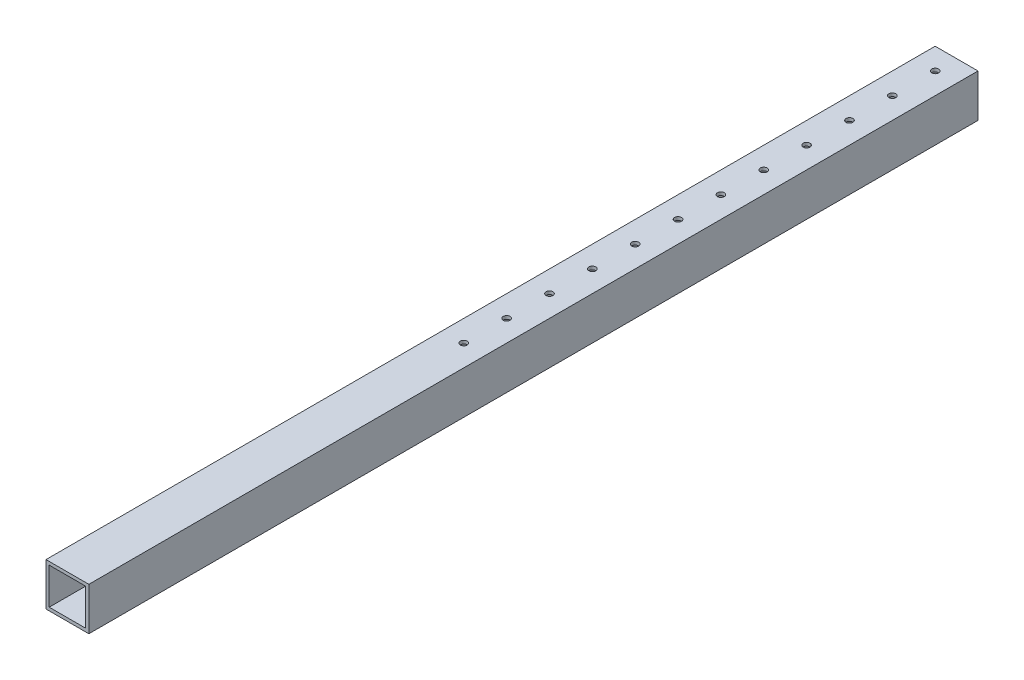
ISO-10303-21;
HEADER;
FILE_DESCRIPTION(('STEP AP214'),'2;1');
FILE_NAME('part.step','',(''),(''),'','','');
FILE_SCHEMA(('AUTOMOTIVE_DESIGN { 1 0 10303 214 1 1 1 1 }'));
ENDSEC;
DATA;
#1=APPLICATION_CONTEXT('core data for automotive mechanical design processes');
#2=APPLICATION_PROTOCOL_DEFINITION('international standard','automotive_design',2000,#1);
#3=PRODUCT_CONTEXT('',#1,'mechanical');
#4=PRODUCT('Part','Part','',(#3));
#5=PRODUCT_RELATED_PRODUCT_CATEGORY('part','',(#4));
#6=PRODUCT_DEFINITION_FORMATION('','',#4);
#7=PRODUCT_DEFINITION_CONTEXT('part definition',#1,'design');
#8=PRODUCT_DEFINITION('design','',#6,#7);
#9=PRODUCT_DEFINITION_SHAPE('','',#8);
#10=(LENGTH_UNIT() NAMED_UNIT(*) SI_UNIT(.MILLI.,.METRE.));
#11=(NAMED_UNIT(*) PLANE_ANGLE_UNIT() SI_UNIT($,.RADIAN.));
#12=(NAMED_UNIT(*) SI_UNIT($,.STERADIAN.) SOLID_ANGLE_UNIT());
#13=UNCERTAINTY_MEASURE_WITH_UNIT(LENGTH_MEASURE(1.E-05),#10,'distance_accuracy_value','');
#14=(GEOMETRIC_REPRESENTATION_CONTEXT(3) GLOBAL_UNCERTAINTY_ASSIGNED_CONTEXT((#13)) GLOBAL_UNIT_ASSIGNED_CONTEXT((#10,
#11,#12)) REPRESENTATION_CONTEXT('',''));
#15=CARTESIAN_POINT('',(0.,0.,0.));
#16=DIRECTION('',(0.,0.,1.));
#17=DIRECTION('',(1.,0.,0.));
#18=AXIS2_PLACEMENT_3D('',#15,#16,#17);
#19=CARTESIAN_POINT('',(0.,0.,415.));
#20=DIRECTION('',(0.,0.,1.));
#21=DIRECTION('',(1.,0.,0.));
#22=AXIS2_PLACEMENT_3D('',#19,#20,#21);
#23=PLANE('',#22);
#24=DIRECTION('',(0.,1.,0.));
#25=VECTOR('',#24,1.);
#26=CARTESIAN_POINT('',(10.,10.,415.));
#27=LINE('',#26,#25);
#28=CARTESIAN_POINT('',(10.,-10.,415.));
#29=VERTEX_POINT('',#28);
#30=CARTESIAN_POINT('',(10.,10.,415.));
#31=VERTEX_POINT('',#30);
#32=EDGE_CURVE('E146',#29,#31,#27,.T.);
#33=ORIENTED_EDGE('',*,*,#32,.T.);
#34=DIRECTION('',(-1.,0.,0.));
#35=VECTOR('',#34,1.);
#36=CARTESIAN_POINT('',(-10.,10.,415.));
#37=LINE('',#36,#35);
#38=CARTESIAN_POINT('',(-10.,10.,415.));
#39=VERTEX_POINT('',#38);
#40=EDGE_CURVE('E149',#31,#39,#37,.T.);
#41=ORIENTED_EDGE('',*,*,#40,.T.);
#42=DIRECTION('',(0.,-1.,0.));
#43=VECTOR('',#42,1.);
#44=CARTESIAN_POINT('',(-10.,10.,415.));
#45=LINE('',#44,#43);
#46=CARTESIAN_POINT('',(-10.,-10.,415.));
#47=VERTEX_POINT('',#46);
#48=EDGE_CURVE('E152',#39,#47,#45,.T.);
#49=ORIENTED_EDGE('',*,*,#48,.T.);
#50=DIRECTION('',(1.,0.,0.));
#51=VECTOR('',#50,1.);
#52=CARTESIAN_POINT('',(-10.,-10.,415.));
#53=LINE('',#52,#51);
#54=EDGE_CURVE('E154',#47,#29,#53,.T.);
#55=ORIENTED_EDGE('',*,*,#54,.T.);
#56=EDGE_LOOP('',(#33,#41,#49,#55));
#57=FACE_BOUND('',#56,.T.);
#58=DIRECTION('',(-1.,0.,0.));
#59=VECTOR('',#58,1.);
#60=CARTESIAN_POINT('',(-8.5,8.5,415.));
#61=LINE('',#60,#59);
#62=CARTESIAN_POINT('',(8.5,8.5,415.));
#63=VERTEX_POINT('',#62);
#64=CARTESIAN_POINT('',(-8.5,8.5,415.));
#65=VERTEX_POINT('',#64);
#66=EDGE_CURVE('E116',#63,#65,#61,.T.);
#67=ORIENTED_EDGE('',*,*,#66,.F.);
#68=DIRECTION('',(0.,1.,0.));
#69=VECTOR('',#68,1.);
#70=CARTESIAN_POINT('',(8.5,8.5,415.));
#71=LINE('',#70,#69);
#72=CARTESIAN_POINT('',(8.5,-8.5,415.));
#73=VERTEX_POINT('',#72);
#74=EDGE_CURVE('E108',#73,#63,#71,.T.);
#75=ORIENTED_EDGE('',*,*,#74,.F.);
#76=DIRECTION('',(1.,0.,0.));
#77=VECTOR('',#76,1.);
#78=CARTESIAN_POINT('',(-8.5,-8.5,415.));
#79=LINE('',#78,#77);
#80=CARTESIAN_POINT('',(-8.5,-8.5,415.));
#81=VERTEX_POINT('',#80);
#82=EDGE_CURVE('E130',#81,#73,#79,.T.);
#83=ORIENTED_EDGE('',*,*,#82,.F.);
#84=DIRECTION('',(0.,-1.,0.));
#85=VECTOR('',#84,1.);
#86=CARTESIAN_POINT('',(-8.5,8.5,415.));
#87=LINE('',#86,#85);
#88=EDGE_CURVE('E128',#65,#81,#87,.T.);
#89=ORIENTED_EDGE('',*,*,#88,.F.);
#90=EDGE_LOOP('',(#67,#75,#83,#89));
#91=FACE_BOUND('',#90,.T.);
#92=ADVANCED_FACE('F41',(#57,#91),#23,.T.);
#93=CARTESIAN_POINT('',(0.,0.,0.));
#94=DIRECTION('',(0.,0.,1.));
#95=DIRECTION('',(1.,0.,0.));
#96=AXIS2_PLACEMENT_3D('',#93,#94,#95);
#97=PLANE('',#96);
#98=DIRECTION('',(0.,1.,0.));
#99=VECTOR('',#98,1.);
#100=CARTESIAN_POINT('',(10.,10.,0.));
#101=LINE('',#100,#99);
#102=CARTESIAN_POINT('',(10.,-10.,0.));
#103=VERTEX_POINT('',#102);
#104=CARTESIAN_POINT('',(10.,10.,0.));
#105=VERTEX_POINT('',#104);
#106=EDGE_CURVE('E124',#103,#105,#101,.T.);
#107=ORIENTED_EDGE('',*,*,#106,.F.);
#108=DIRECTION('',(1.,0.,0.));
#109=VECTOR('',#108,1.);
#110=CARTESIAN_POINT('',(-10.,-10.,0.));
#111=LINE('',#110,#109);
#112=CARTESIAN_POINT('',(-10.,-10.,0.));
#113=VERTEX_POINT('',#112);
#114=EDGE_CURVE('E150',#113,#103,#111,.T.);
#115=ORIENTED_EDGE('',*,*,#114,.F.);
#116=DIRECTION('',(0.,-1.,0.));
#117=VECTOR('',#116,1.);
#118=CARTESIAN_POINT('',(-10.,10.,0.));
#119=LINE('',#118,#117);
#120=CARTESIAN_POINT('',(-10.,10.,0.));
#121=VERTEX_POINT('',#120);
#122=EDGE_CURVE('E161',#121,#113,#119,.T.);
#123=ORIENTED_EDGE('',*,*,#122,.F.);
#124=DIRECTION('',(-1.,0.,0.));
#125=VECTOR('',#124,1.);
#126=CARTESIAN_POINT('',(-10.,10.,0.));
#127=LINE('',#126,#125);
#128=EDGE_CURVE('E159',#105,#121,#127,.T.);
#129=ORIENTED_EDGE('',*,*,#128,.F.);
#130=EDGE_LOOP('',(#107,#115,#123,#129));
#131=FACE_BOUND('',#130,.T.);
#132=DIRECTION('',(0.,1.,0.));
#133=VECTOR('',#132,1.);
#134=CARTESIAN_POINT('',(8.5,8.5,0.));
#135=LINE('',#134,#133);
#136=CARTESIAN_POINT('',(8.5,-8.5,0.));
#137=VERTEX_POINT('',#136);
#138=CARTESIAN_POINT('',(8.5,8.5,0.));
#139=VERTEX_POINT('',#138);
#140=EDGE_CURVE('E66',#137,#139,#135,.T.);
#141=ORIENTED_EDGE('',*,*,#140,.T.);
#142=DIRECTION('',(-1.,0.,0.));
#143=VECTOR('',#142,1.);
#144=CARTESIAN_POINT('',(-8.5,8.5,0.));
#145=LINE('',#144,#143);
#146=CARTESIAN_POINT('',(-8.5,8.5,0.));
#147=VERTEX_POINT('',#146);
#148=EDGE_CURVE('E123',#139,#147,#145,.T.);
#149=ORIENTED_EDGE('',*,*,#148,.T.);
#150=DIRECTION('',(0.,-1.,0.));
#151=VECTOR('',#150,1.);
#152=CARTESIAN_POINT('',(-8.5,8.5,0.));
#153=LINE('',#152,#151);
#154=CARTESIAN_POINT('',(-8.5,-8.5,0.));
#155=VERTEX_POINT('',#154);
#156=EDGE_CURVE('E138',#147,#155,#153,.T.);
#157=ORIENTED_EDGE('',*,*,#156,.T.);
#158=DIRECTION('',(1.,0.,0.));
#159=VECTOR('',#158,1.);
#160=CARTESIAN_POINT('',(-8.5,-8.5,0.));
#161=LINE('',#160,#159);
#162=EDGE_CURVE('E117',#155,#137,#161,.T.);
#163=ORIENTED_EDGE('',*,*,#162,.T.);
#164=EDGE_LOOP('',(#141,#149,#157,#163));
#165=FACE_BOUND('',#164,.T.);
#166=ADVANCED_FACE('F261',(#131,#165),#97,.F.);
#167=CARTESIAN_POINT('',(10.,10.,415.));
#168=DIRECTION('',(-1.,0.,0.));
#169=DIRECTION('',(0.,-1.,0.));
#170=AXIS2_PLACEMENT_3D('',#167,#168,#169);
#171=PLANE('',#170);
#172=ORIENTED_EDGE('',*,*,#106,.T.);
#173=DIRECTION('',(0.,0.,-1.));
#174=VECTOR('',#173,1.);
#175=CARTESIAN_POINT('',(10.,10.,415.));
#176=LINE('',#175,#174);
#177=EDGE_CURVE('E11',#31,#105,#176,.T.);
#178=ORIENTED_EDGE('',*,*,#177,.F.);
#179=ORIENTED_EDGE('',*,*,#32,.F.);
#180=DIRECTION('',(0.,0.,-1.));
#181=VECTOR('',#180,1.);
#182=CARTESIAN_POINT('',(10.,-10.,415.));
#183=LINE('',#182,#181);
#184=EDGE_CURVE('E156',#29,#103,#183,.T.);
#185=ORIENTED_EDGE('',*,*,#184,.T.);
#186=EDGE_LOOP('',(#172,#178,#179,#185));
#187=FACE_BOUND('',#186,.T.);
#188=ADVANCED_FACE('F43',(#187),#171,.F.);
#189=CARTESIAN_POINT('',(-10.,10.,415.));
#190=DIRECTION('',(0.,-1.,0.));
#191=DIRECTION('',(0.,0.,-1.));
#192=AXIS2_PLACEMENT_3D('',#189,#190,#191);
#193=PLANE('',#192);
#194=CARTESIAN_POINT('',(0.,10.,10.));
#195=DIRECTION('',(0.,-1.,0.));
#196=DIRECTION('',(0.,0.,-1.));
#197=AXIS2_PLACEMENT_3D('',#194,#195,#196);
#198=CIRCLE('',#197,1.6);
#199=CARTESIAN_POINT('',(0.,10.,8.4));
#200=VERTEX_POINT('',#199);
#201=EDGE_CURVE('E175',#200,#200,#198,.T.);
#202=ORIENTED_EDGE('',*,*,#201,.T.);
#203=EDGE_LOOP('',(#202));
#204=FACE_BOUND('',#203,.T.);
#205=CARTESIAN_POINT('',(0.,10.,30.));
#206=DIRECTION('',(0.,-1.,0.));
#207=DIRECTION('',(0.,0.,-1.));
#208=AXIS2_PLACEMENT_3D('',#205,#206,#207);
#209=CIRCLE('',#208,1.6);
#210=CARTESIAN_POINT('',(0.,10.,28.4));
#211=VERTEX_POINT('',#210);
#212=EDGE_CURVE('E301',#211,#211,#209,.T.);
#213=ORIENTED_EDGE('',*,*,#212,.T.);
#214=EDGE_LOOP('',(#213));
#215=FACE_BOUND('',#214,.T.);
#216=CARTESIAN_POINT('',(-1.38434606754578E-13,10.,50.));
#217=DIRECTION('',(0.,-1.,0.));
#218=DIRECTION('',(0.,0.,-1.));
#219=AXIS2_PLACEMENT_3D('',#216,#217,#218);
#220=CIRCLE('',#219,1.6);
#221=CARTESIAN_POINT('',(-1.38434606754578E-13,10.,48.4));
#222=VERTEX_POINT('',#221);
#223=EDGE_CURVE('E305',#222,#222,#220,.T.);
#224=ORIENTED_EDGE('',*,*,#223,.T.);
#225=EDGE_LOOP('',(#224));
#226=FACE_BOUND('',#225,.T.);
#227=CARTESIAN_POINT('',(-2.07039586732293E-13,10.,70.));
#228=DIRECTION('',(0.,-1.,0.));
#229=DIRECTION('',(0.,0.,-1.));
#230=AXIS2_PLACEMENT_3D('',#227,#228,#229);
#231=CIRCLE('',#230,1.6);
#232=CARTESIAN_POINT('',(-2.07039586732293E-13,10.,68.4));
#233=VERTEX_POINT('',#232);
#234=EDGE_CURVE('E309',#233,#233,#231,.T.);
#235=ORIENTED_EDGE('',*,*,#234,.T.);
#236=EDGE_LOOP('',(#235));
#237=FACE_BOUND('',#236,.T.);
#238=CARTESIAN_POINT('',(-2.75644566710009E-13,10.,90.));
#239=DIRECTION('',(0.,-1.,0.));
#240=DIRECTION('',(0.,0.,-1.));
#241=AXIS2_PLACEMENT_3D('',#238,#239,#240);
#242=CIRCLE('',#241,1.6);
#243=CARTESIAN_POINT('',(-2.75644566710009E-13,10.,88.4));
#244=VERTEX_POINT('',#243);
#245=EDGE_CURVE('E313',#244,#244,#242,.T.);
#246=ORIENTED_EDGE('',*,*,#245,.T.);
#247=EDGE_LOOP('',(#246));
#248=FACE_BOUND('',#247,.T.);
#249=CARTESIAN_POINT('',(-3.44249546687724E-13,10.,110.));
#250=DIRECTION('',(0.,-1.,0.));
#251=DIRECTION('',(0.,0.,-1.));
#252=AXIS2_PLACEMENT_3D('',#249,#250,#251);
#253=CIRCLE('',#252,1.6);
#254=CARTESIAN_POINT('',(-3.44249546687724E-13,10.,108.4));
#255=VERTEX_POINT('',#254);
#256=EDGE_CURVE('E317',#255,#255,#253,.T.);
#257=ORIENTED_EDGE('',*,*,#256,.T.);
#258=EDGE_LOOP('',(#257));
#259=FACE_BOUND('',#258,.T.);
#260=CARTESIAN_POINT('',(-4.12854526665439E-13,10.,130.));
#261=DIRECTION('',(0.,-1.,0.));
#262=DIRECTION('',(0.,0.,-1.));
#263=AXIS2_PLACEMENT_3D('',#260,#261,#262);
#264=CIRCLE('',#263,1.6);
#265=CARTESIAN_POINT('',(-4.12854526665439E-13,10.,128.4));
#266=VERTEX_POINT('',#265);
#267=EDGE_CURVE('E321',#266,#266,#264,.T.);
#268=ORIENTED_EDGE('',*,*,#267,.T.);
#269=EDGE_LOOP('',(#268));
#270=FACE_BOUND('',#269,.T.);
#271=CARTESIAN_POINT('',(-4.81459506643155E-13,10.,150.));
#272=DIRECTION('',(0.,-1.,0.));
#273=DIRECTION('',(0.,0.,-1.));
#274=AXIS2_PLACEMENT_3D('',#271,#272,#273);
#275=CIRCLE('',#274,1.6);
#276=CARTESIAN_POINT('',(-4.81459506643155E-13,10.,148.4));
#277=VERTEX_POINT('',#276);
#278=EDGE_CURVE('E325',#277,#277,#275,.T.);
#279=ORIENTED_EDGE('',*,*,#278,.T.);
#280=EDGE_LOOP('',(#279));
#281=FACE_BOUND('',#280,.T.);
#282=CARTESIAN_POINT('',(-5.5006448662087E-13,10.,170.));
#283=DIRECTION('',(0.,-1.,0.));
#284=DIRECTION('',(0.,0.,-1.));
#285=AXIS2_PLACEMENT_3D('',#282,#283,#284);
#286=CIRCLE('',#285,1.6);
#287=CARTESIAN_POINT('',(-5.5006448662087E-13,10.,168.4));
#288=VERTEX_POINT('',#287);
#289=EDGE_CURVE('E329',#288,#288,#286,.T.);
#290=ORIENTED_EDGE('',*,*,#289,.T.);
#291=EDGE_LOOP('',(#290));
#292=FACE_BOUND('',#291,.T.);
#293=CARTESIAN_POINT('',(-6.18669466598585E-13,10.,190.));
#294=DIRECTION('',(0.,-1.,0.));
#295=DIRECTION('',(0.,0.,-1.));
#296=AXIS2_PLACEMENT_3D('',#293,#294,#295);
#297=CIRCLE('',#296,1.6);
#298=CARTESIAN_POINT('',(-6.18669466598585E-13,10.,188.4));
#299=VERTEX_POINT('',#298);
#300=EDGE_CURVE('E333',#299,#299,#297,.T.);
#301=ORIENTED_EDGE('',*,*,#300,.T.);
#302=EDGE_LOOP('',(#301));
#303=FACE_BOUND('',#302,.T.);
#304=CARTESIAN_POINT('',(-6.87274446576301E-13,10.,210.));
#305=DIRECTION('',(0.,-1.,0.));
#306=DIRECTION('',(0.,0.,-1.));
#307=AXIS2_PLACEMENT_3D('',#304,#305,#306);
#308=CIRCLE('',#307,1.6);
#309=CARTESIAN_POINT('',(-6.87274446576301E-13,10.,208.4));
#310=VERTEX_POINT('',#309);
#311=EDGE_CURVE('E337',#310,#310,#308,.T.);
#312=ORIENTED_EDGE('',*,*,#311,.T.);
#313=EDGE_LOOP('',(#312));
#314=FACE_BOUND('',#313,.T.);
#315=CARTESIAN_POINT('',(-7.55879426554016E-13,10.,230.));
#316=DIRECTION('',(0.,-1.,0.));
#317=DIRECTION('',(0.,0.,-1.));
#318=AXIS2_PLACEMENT_3D('',#315,#316,#317);
#319=CIRCLE('',#318,1.6);
#320=CARTESIAN_POINT('',(-7.55879426554016E-13,10.,228.4));
#321=VERTEX_POINT('',#320);
#322=EDGE_CURVE('E341',#321,#321,#319,.T.);
#323=ORIENTED_EDGE('',*,*,#322,.T.);
#324=EDGE_LOOP('',(#323));
#325=FACE_BOUND('',#324,.T.);
#326=ORIENTED_EDGE('',*,*,#128,.T.);
#327=DIRECTION('',(0.,0.,-1.));
#328=VECTOR('',#327,1.);
#329=CARTESIAN_POINT('',(-10.,10.,415.));
#330=LINE('',#329,#328);
#331=EDGE_CURVE('E50',#39,#121,#330,.T.);
#332=ORIENTED_EDGE('',*,*,#331,.F.);
#333=ORIENTED_EDGE('',*,*,#40,.F.);
#334=ORIENTED_EDGE('',*,*,#177,.T.);
#335=EDGE_LOOP('',(#326,#332,#333,#334));
#336=FACE_BOUND('',#335,.T.);
#337=ADVANCED_FACE('F288',(#204,#215,#226,#237,#248,#259,#270,#281,#292,#303,#314,#325,#336),
#193,.F.);
#338=CARTESIAN_POINT('',(-10.,10.,415.));
#339=DIRECTION('',(1.,0.,0.));
#340=DIRECTION('',(0.,1.,0.));
#341=AXIS2_PLACEMENT_3D('',#338,#339,#340);
#342=PLANE('',#341);
#343=ORIENTED_EDGE('',*,*,#122,.T.);
#344=DIRECTION('',(0.,0.,-1.));
#345=VECTOR('',#344,1.);
#346=CARTESIAN_POINT('',(-10.,-10.,415.));
#347=LINE('',#346,#345);
#348=EDGE_CURVE('E166',#47,#113,#347,.T.);
#349=ORIENTED_EDGE('',*,*,#348,.F.);
#350=ORIENTED_EDGE('',*,*,#48,.F.);
#351=ORIENTED_EDGE('',*,*,#331,.T.);
#352=EDGE_LOOP('',(#343,#349,#350,#351));
#353=FACE_BOUND('',#352,.T.);
#354=ADVANCED_FACE('F285',(#353),#342,.F.);
#355=CARTESIAN_POINT('',(-10.,-10.,415.));
#356=DIRECTION('',(0.,1.,0.));
#357=DIRECTION('',(0.,0.,1.));
#358=AXIS2_PLACEMENT_3D('',#355,#356,#357);
#359=PLANE('',#358);
#360=CARTESIAN_POINT('',(0.,-10.,10.));
#361=DIRECTION('',(0.,-1.,0.));
#362=DIRECTION('',(0.,0.,-1.));
#363=AXIS2_PLACEMENT_3D('',#360,#361,#362);
#364=CIRCLE('',#363,1.6);
#365=CARTESIAN_POINT('',(0.,-10.,8.4));
#366=VERTEX_POINT('',#365);
#367=EDGE_CURVE('E477',#366,#366,#364,.T.);
#368=ORIENTED_EDGE('',*,*,#367,.F.);
#369=EDGE_LOOP('',(#368));
#370=FACE_BOUND('',#369,.T.);
#371=CARTESIAN_POINT('',(0.,-10.,30.));
#372=DIRECTION('',(0.,-1.,0.));
#373=DIRECTION('',(0.,0.,-1.));
#374=AXIS2_PLACEMENT_3D('',#371,#372,#373);
#375=CIRCLE('',#374,1.6);
#376=CARTESIAN_POINT('',(0.,-10.,28.4));
#377=VERTEX_POINT('',#376);
#378=EDGE_CURVE('E473',#377,#377,#375,.T.);
#379=ORIENTED_EDGE('',*,*,#378,.F.);
#380=EDGE_LOOP('',(#379));
#381=FACE_BOUND('',#380,.T.);
#382=CARTESIAN_POINT('',(-1.38434606754578E-13,-10.,50.));
#383=DIRECTION('',(0.,-1.,0.));
#384=DIRECTION('',(0.,0.,-1.));
#385=AXIS2_PLACEMENT_3D('',#382,#383,#384);
#386=CIRCLE('',#385,1.6);
#387=CARTESIAN_POINT('',(-1.38434606754578E-13,-10.,48.4));
#388=VERTEX_POINT('',#387);
#389=EDGE_CURVE('E474',#388,#388,#386,.T.);
#390=ORIENTED_EDGE('',*,*,#389,.F.);
#391=EDGE_LOOP('',(#390));
#392=FACE_BOUND('',#391,.T.);
#393=CARTESIAN_POINT('',(-2.07039586732293E-13,-10.,70.));
#394=DIRECTION('',(0.,-1.,0.));
#395=DIRECTION('',(0.,0.,-1.));
#396=AXIS2_PLACEMENT_3D('',#393,#394,#395);
#397=CIRCLE('',#396,1.6);
#398=CARTESIAN_POINT('',(-2.07039586732293E-13,-10.,68.4));
#399=VERTEX_POINT('',#398);
#400=EDGE_CURVE('E484',#399,#399,#397,.T.);
#401=ORIENTED_EDGE('',*,*,#400,.F.);
#402=EDGE_LOOP('',(#401));
#403=FACE_BOUND('',#402,.T.);
#404=CARTESIAN_POINT('',(-2.75644566710009E-13,-10.,90.));
#405=DIRECTION('',(0.,-1.,0.));
#406=DIRECTION('',(0.,0.,-1.));
#407=AXIS2_PLACEMENT_3D('',#404,#405,#406);
#408=CIRCLE('',#407,1.6);
#409=CARTESIAN_POINT('',(-2.75644566710009E-13,-10.,88.4));
#410=VERTEX_POINT('',#409);
#411=EDGE_CURVE('E488',#410,#410,#408,.T.);
#412=ORIENTED_EDGE('',*,*,#411,.F.);
#413=EDGE_LOOP('',(#412));
#414=FACE_BOUND('',#413,.T.);
#415=CARTESIAN_POINT('',(-3.44249546687724E-13,-10.,110.));
#416=DIRECTION('',(0.,-1.,0.));
#417=DIRECTION('',(0.,0.,-1.));
#418=AXIS2_PLACEMENT_3D('',#415,#416,#417);
#419=CIRCLE('',#418,1.6);
#420=CARTESIAN_POINT('',(-3.44249546687724E-13,-10.,108.4));
#421=VERTEX_POINT('',#420);
#422=EDGE_CURVE('E492',#421,#421,#419,.T.);
#423=ORIENTED_EDGE('',*,*,#422,.F.);
#424=EDGE_LOOP('',(#423));
#425=FACE_BOUND('',#424,.T.);
#426=CARTESIAN_POINT('',(-4.12854526665439E-13,-10.,130.));
#427=DIRECTION('',(0.,-1.,0.));
#428=DIRECTION('',(0.,0.,-1.));
#429=AXIS2_PLACEMENT_3D('',#426,#427,#428);
#430=CIRCLE('',#429,1.6);
#431=CARTESIAN_POINT('',(-4.12854526665439E-13,-10.,128.4));
#432=VERTEX_POINT('',#431);
#433=EDGE_CURVE('E496',#432,#432,#430,.T.);
#434=ORIENTED_EDGE('',*,*,#433,.F.);
#435=EDGE_LOOP('',(#434));
#436=FACE_BOUND('',#435,.T.);
#437=CARTESIAN_POINT('',(-4.81459506643155E-13,-10.,150.));
#438=DIRECTION('',(0.,-1.,0.));
#439=DIRECTION('',(0.,0.,-1.));
#440=AXIS2_PLACEMENT_3D('',#437,#438,#439);
#441=CIRCLE('',#440,1.6);
#442=CARTESIAN_POINT('',(-4.81459506643155E-13,-10.,148.4));
#443=VERTEX_POINT('',#442);
#444=EDGE_CURVE('E500',#443,#443,#441,.T.);
#445=ORIENTED_EDGE('',*,*,#444,.F.);
#446=EDGE_LOOP('',(#445));
#447=FACE_BOUND('',#446,.T.);
#448=CARTESIAN_POINT('',(-5.5006448662087E-13,-10.,170.));
#449=DIRECTION('',(0.,-1.,0.));
#450=DIRECTION('',(0.,0.,-1.));
#451=AXIS2_PLACEMENT_3D('',#448,#449,#450);
#452=CIRCLE('',#451,1.6);
#453=CARTESIAN_POINT('',(-5.5006448662087E-13,-10.,168.4));
#454=VERTEX_POINT('',#453);
#455=EDGE_CURVE('E504',#454,#454,#452,.T.);
#456=ORIENTED_EDGE('',*,*,#455,.F.);
#457=EDGE_LOOP('',(#456));
#458=FACE_BOUND('',#457,.T.);
#459=CARTESIAN_POINT('',(-6.18669466598585E-13,-10.,190.));
#460=DIRECTION('',(0.,-1.,0.));
#461=DIRECTION('',(0.,0.,-1.));
#462=AXIS2_PLACEMENT_3D('',#459,#460,#461);
#463=CIRCLE('',#462,1.6);
#464=CARTESIAN_POINT('',(-6.18669466598585E-13,-10.,188.4));
#465=VERTEX_POINT('',#464);
#466=EDGE_CURVE('E508',#465,#465,#463,.T.);
#467=ORIENTED_EDGE('',*,*,#466,.F.);
#468=EDGE_LOOP('',(#467));
#469=FACE_BOUND('',#468,.T.);
#470=CARTESIAN_POINT('',(-6.87274446576301E-13,-10.,210.));
#471=DIRECTION('',(0.,-1.,0.));
#472=DIRECTION('',(0.,0.,-1.));
#473=AXIS2_PLACEMENT_3D('',#470,#471,#472);
#474=CIRCLE('',#473,1.6);
#475=CARTESIAN_POINT('',(-6.87274446576301E-13,-10.,208.4));
#476=VERTEX_POINT('',#475);
#477=EDGE_CURVE('E512',#476,#476,#474,.T.);
#478=ORIENTED_EDGE('',*,*,#477,.F.);
#479=EDGE_LOOP('',(#478));
#480=FACE_BOUND('',#479,.T.);
#481=CARTESIAN_POINT('',(-7.55879426554016E-13,-10.,230.));
#482=DIRECTION('',(0.,-1.,0.));
#483=DIRECTION('',(0.,0.,-1.));
#484=AXIS2_PLACEMENT_3D('',#481,#482,#483);
#485=CIRCLE('',#484,1.6);
#486=CARTESIAN_POINT('',(-7.55879426554016E-13,-10.,228.4));
#487=VERTEX_POINT('',#486);
#488=EDGE_CURVE('E354',#487,#487,#485,.T.);
#489=ORIENTED_EDGE('',*,*,#488,.F.);
#490=EDGE_LOOP('',(#489));
#491=FACE_BOUND('',#490,.T.);
#492=ORIENTED_EDGE('',*,*,#114,.T.);
#493=ORIENTED_EDGE('',*,*,#184,.F.);
#494=ORIENTED_EDGE('',*,*,#54,.F.);
#495=ORIENTED_EDGE('',*,*,#348,.T.);
#496=EDGE_LOOP('',(#492,#493,#494,#495));
#497=FACE_BOUND('',#496,.T.);
#498=ADVANCED_FACE('F282',(#370,#381,#392,#403,#414,#425,#436,#447,#458,#469,#480,#491,#497),
#359,.F.);
#499=CARTESIAN_POINT('',(8.5,8.5,415.));
#500=DIRECTION('',(-1.,0.,0.));
#501=DIRECTION('',(0.,0.,1.));
#502=AXIS2_PLACEMENT_3D('',#499,#500,#501);
#503=PLANE('',#502);
#504=ORIENTED_EDGE('',*,*,#140,.F.);
#505=DIRECTION('',(0.,0.,-1.));
#506=VECTOR('',#505,1.);
#507=CARTESIAN_POINT('',(8.5,-8.5,415.));
#508=LINE('',#507,#506);
#509=EDGE_CURVE('E112',#73,#137,#508,.T.);
#510=ORIENTED_EDGE('',*,*,#509,.F.);
#511=ORIENTED_EDGE('',*,*,#74,.T.);
#512=DIRECTION('',(0.,0.,-1.));
#513=VECTOR('',#512,1.);
#514=CARTESIAN_POINT('',(8.5,8.5,415.));
#515=LINE('',#514,#513);
#516=EDGE_CURVE('E111',#63,#139,#515,.T.);
#517=ORIENTED_EDGE('',*,*,#516,.T.);
#518=EDGE_LOOP('',(#504,#510,#511,#517));
#519=FACE_BOUND('',#518,.T.);
#520=ADVANCED_FACE('F110',(#519),#503,.T.);
#521=CARTESIAN_POINT('',(-8.5,8.5,415.));
#522=DIRECTION('',(0.,-1.,0.));
#523=DIRECTION('',(0.,0.,-1.));
#524=AXIS2_PLACEMENT_3D('',#521,#522,#523);
#525=PLANE('',#524);
#526=CARTESIAN_POINT('',(0.,8.5,10.));
#527=DIRECTION('',(0.,-1.,0.));
#528=DIRECTION('',(0.,0.,-1.));
#529=AXIS2_PLACEMENT_3D('',#526,#527,#528);
#530=CIRCLE('',#529,1.6);
#531=CARTESIAN_POINT('',(0.,8.5,8.4));
#532=VERTEX_POINT('',#531);
#533=EDGE_CURVE('E136',#532,#532,#530,.T.);
#534=ORIENTED_EDGE('',*,*,#533,.F.);
#535=EDGE_LOOP('',(#534));
#536=FACE_BOUND('',#535,.T.);
#537=CARTESIAN_POINT('',(0.,8.5,30.));
#538=DIRECTION('',(0.,-1.,0.));
#539=DIRECTION('',(0.,0.,-1.));
#540=AXIS2_PLACEMENT_3D('',#537,#538,#539);
#541=CIRCLE('',#540,1.6);
#542=CARTESIAN_POINT('',(0.,8.5,28.4));
#543=VERTEX_POINT('',#542);
#544=EDGE_CURVE('E213',#543,#543,#541,.T.);
#545=ORIENTED_EDGE('',*,*,#544,.F.);
#546=EDGE_LOOP('',(#545));
#547=FACE_BOUND('',#546,.T.);
#548=CARTESIAN_POINT('',(-1.38434606754578E-13,8.5,50.));
#549=DIRECTION('',(0.,-1.,0.));
#550=DIRECTION('',(0.,0.,-1.));
#551=AXIS2_PLACEMENT_3D('',#548,#549,#550);
#552=CIRCLE('',#551,1.6);
#553=CARTESIAN_POINT('',(-1.38434606754578E-13,8.5,48.4));
#554=VERTEX_POINT('',#553);
#555=EDGE_CURVE('E210',#554,#554,#552,.T.);
#556=ORIENTED_EDGE('',*,*,#555,.F.);
#557=EDGE_LOOP('',(#556));
#558=FACE_BOUND('',#557,.T.);
#559=CARTESIAN_POINT('',(-2.07039586732293E-13,8.5,70.));
#560=DIRECTION('',(0.,-1.,0.));
#561=DIRECTION('',(0.,0.,-1.));
#562=AXIS2_PLACEMENT_3D('',#559,#560,#561);
#563=CIRCLE('',#562,1.6);
#564=CARTESIAN_POINT('',(-2.07039586732293E-13,8.5,68.4));
#565=VERTEX_POINT('',#564);
#566=EDGE_CURVE('E207',#565,#565,#563,.T.);
#567=ORIENTED_EDGE('',*,*,#566,.F.);
#568=EDGE_LOOP('',(#567));
#569=FACE_BOUND('',#568,.T.);
#570=CARTESIAN_POINT('',(-2.75644566710009E-13,8.5,90.));
#571=DIRECTION('',(0.,-1.,0.));
#572=DIRECTION('',(0.,0.,-1.));
#573=AXIS2_PLACEMENT_3D('',#570,#571,#572);
#574=CIRCLE('',#573,1.6);
#575=CARTESIAN_POINT('',(-2.75644566710009E-13,8.5,88.4));
#576=VERTEX_POINT('',#575);
#577=EDGE_CURVE('E203',#576,#576,#574,.T.);
#578=ORIENTED_EDGE('',*,*,#577,.F.);
#579=EDGE_LOOP('',(#578));
#580=FACE_BOUND('',#579,.T.);
#581=CARTESIAN_POINT('',(-3.44249546687724E-13,8.5,110.));
#582=DIRECTION('',(0.,-1.,0.));
#583=DIRECTION('',(0.,0.,-1.));
#584=AXIS2_PLACEMENT_3D('',#581,#582,#583);
#585=CIRCLE('',#584,1.6);
#586=CARTESIAN_POINT('',(-3.44249546687724E-13,8.5,108.4));
#587=VERTEX_POINT('',#586);
#588=EDGE_CURVE('E199',#587,#587,#585,.T.);
#589=ORIENTED_EDGE('',*,*,#588,.F.);
#590=EDGE_LOOP('',(#589));
#591=FACE_BOUND('',#590,.T.);
#592=CARTESIAN_POINT('',(-4.12854526665439E-13,8.5,130.));
#593=DIRECTION('',(0.,-1.,0.));
#594=DIRECTION('',(0.,0.,-1.));
#595=AXIS2_PLACEMENT_3D('',#592,#593,#594);
#596=CIRCLE('',#595,1.6);
#597=CARTESIAN_POINT('',(-4.12854526665439E-13,8.5,128.4));
#598=VERTEX_POINT('',#597);
#599=EDGE_CURVE('E195',#598,#598,#596,.T.);
#600=ORIENTED_EDGE('',*,*,#599,.F.);
#601=EDGE_LOOP('',(#600));
#602=FACE_BOUND('',#601,.T.);
#603=CARTESIAN_POINT('',(-4.81459506643155E-13,8.5,150.));
#604=DIRECTION('',(0.,-1.,0.));
#605=DIRECTION('',(0.,0.,-1.));
#606=AXIS2_PLACEMENT_3D('',#603,#604,#605);
#607=CIRCLE('',#606,1.6);
#608=CARTESIAN_POINT('',(-4.81459506643155E-13,8.5,148.4));
#609=VERTEX_POINT('',#608);
#610=EDGE_CURVE('E191',#609,#609,#607,.T.);
#611=ORIENTED_EDGE('',*,*,#610,.F.);
#612=EDGE_LOOP('',(#611));
#613=FACE_BOUND('',#612,.T.);
#614=CARTESIAN_POINT('',(-5.5006448662087E-13,8.5,170.));
#615=DIRECTION('',(0.,-1.,0.));
#616=DIRECTION('',(0.,0.,-1.));
#617=AXIS2_PLACEMENT_3D('',#614,#615,#616);
#618=CIRCLE('',#617,1.6);
#619=CARTESIAN_POINT('',(-5.5006448662087E-13,8.5,168.4));
#620=VERTEX_POINT('',#619);
#621=EDGE_CURVE('E187',#620,#620,#618,.T.);
#622=ORIENTED_EDGE('',*,*,#621,.F.);
#623=EDGE_LOOP('',(#622));
#624=FACE_BOUND('',#623,.T.);
#625=CARTESIAN_POINT('',(-6.18669466598585E-13,8.5,190.));
#626=DIRECTION('',(0.,-1.,0.));
#627=DIRECTION('',(0.,0.,-1.));
#628=AXIS2_PLACEMENT_3D('',#625,#626,#627);
#629=CIRCLE('',#628,1.6);
#630=CARTESIAN_POINT('',(-6.18669466598585E-13,8.5,188.4));
#631=VERTEX_POINT('',#630);
#632=EDGE_CURVE('E183',#631,#631,#629,.T.);
#633=ORIENTED_EDGE('',*,*,#632,.F.);
#634=EDGE_LOOP('',(#633));
#635=FACE_BOUND('',#634,.T.);
#636=CARTESIAN_POINT('',(-6.87274446576301E-13,8.5,210.));
#637=DIRECTION('',(0.,-1.,0.));
#638=DIRECTION('',(0.,0.,-1.));
#639=AXIS2_PLACEMENT_3D('',#636,#637,#638);
#640=CIRCLE('',#639,1.6);
#641=CARTESIAN_POINT('',(-6.87274446576301E-13,8.5,208.4));
#642=VERTEX_POINT('',#641);
#643=EDGE_CURVE('E179',#642,#642,#640,.T.);
#644=ORIENTED_EDGE('',*,*,#643,.F.);
#645=EDGE_LOOP('',(#644));
#646=FACE_BOUND('',#645,.T.);
#647=CARTESIAN_POINT('',(-7.55879426554016E-13,8.5,230.));
#648=DIRECTION('',(0.,-1.,0.));
#649=DIRECTION('',(0.,0.,-1.));
#650=AXIS2_PLACEMENT_3D('',#647,#648,#649);
#651=CIRCLE('',#650,1.6);
#652=CARTESIAN_POINT('',(-7.55879426554016E-13,8.5,228.4));
#653=VERTEX_POINT('',#652);
#654=EDGE_CURVE('E174',#653,#653,#651,.T.);
#655=ORIENTED_EDGE('',*,*,#654,.F.);
#656=EDGE_LOOP('',(#655));
#657=FACE_BOUND('',#656,.T.);
#658=ORIENTED_EDGE('',*,*,#148,.F.);
#659=ORIENTED_EDGE('',*,*,#516,.F.);
#660=ORIENTED_EDGE('',*,*,#66,.T.);
#661=DIRECTION('',(0.,0.,-1.));
#662=VECTOR('',#661,1.);
#663=CARTESIAN_POINT('',(-8.5,8.5,415.));
#664=LINE('',#663,#662);
#665=EDGE_CURVE('E125',#65,#147,#664,.T.);
#666=ORIENTED_EDGE('',*,*,#665,.T.);
#667=EDGE_LOOP('',(#658,#659,#660,#666));
#668=FACE_BOUND('',#667,.T.);
#669=ADVANCED_FACE('F120',(#536,#547,#558,#569,#580,#591,#602,#613,#624,#635,#646,#657,#668),
#525,.T.);
#670=CARTESIAN_POINT('',(-8.5,8.5,415.));
#671=DIRECTION('',(1.,0.,0.));
#672=DIRECTION('',(0.,1.,0.));
#673=AXIS2_PLACEMENT_3D('',#670,#671,#672);
#674=PLANE('',#673);
#675=ORIENTED_EDGE('',*,*,#156,.F.);
#676=ORIENTED_EDGE('',*,*,#665,.F.);
#677=ORIENTED_EDGE('',*,*,#88,.T.);
#678=DIRECTION('',(0.,0.,-1.));
#679=VECTOR('',#678,1.);
#680=CARTESIAN_POINT('',(-8.5,-8.5,415.));
#681=LINE('',#680,#679);
#682=EDGE_CURVE('E58',#81,#155,#681,.T.);
#683=ORIENTED_EDGE('',*,*,#682,.T.);
#684=EDGE_LOOP('',(#675,#676,#677,#683));
#685=FACE_BOUND('',#684,.T.);
#686=ADVANCED_FACE('F237',(#685),#674,.T.);
#687=CARTESIAN_POINT('',(-8.5,-8.5,415.));
#688=DIRECTION('',(0.,1.,0.));
#689=DIRECTION('',(0.,0.,1.));
#690=AXIS2_PLACEMENT_3D('',#687,#688,#689);
#691=PLANE('',#690);
#692=CARTESIAN_POINT('',(0.,-8.5,10.));
#693=DIRECTION('',(0.,1.,0.));
#694=DIRECTION('',(0.,0.,1.));
#695=AXIS2_PLACEMENT_3D('',#692,#693,#694);
#696=CIRCLE('',#695,1.6);
#697=CARTESIAN_POINT('',(0.,-8.5,11.6));
#698=VERTEX_POINT('',#697);
#699=EDGE_CURVE('E45',#698,#698,#696,.T.);
#700=ORIENTED_EDGE('',*,*,#699,.F.);
#701=EDGE_LOOP('',(#700));
#702=FACE_BOUND('',#701,.T.);
#703=CARTESIAN_POINT('',(0.,-8.5,30.));
#704=DIRECTION('',(0.,1.,0.));
#705=DIRECTION('',(0.,0.,1.));
#706=AXIS2_PLACEMENT_3D('',#703,#704,#705);
#707=CIRCLE('',#706,1.6);
#708=CARTESIAN_POINT('',(0.,-8.5,31.6));
#709=VERTEX_POINT('',#708);
#710=EDGE_CURVE('E211',#709,#709,#707,.T.);
#711=ORIENTED_EDGE('',*,*,#710,.F.);
#712=EDGE_LOOP('',(#711));
#713=FACE_BOUND('',#712,.T.);
#714=CARTESIAN_POINT('',(-1.38434606754578E-13,-8.5,50.));
#715=DIRECTION('',(0.,1.,0.));
#716=DIRECTION('',(0.,0.,1.));
#717=AXIS2_PLACEMENT_3D('',#714,#715,#716);
#718=CIRCLE('',#717,1.6);
#719=CARTESIAN_POINT('',(-1.38434606754578E-13,-8.5,51.6));
#720=VERTEX_POINT('',#719);
#721=EDGE_CURVE('E208',#720,#720,#718,.T.);
#722=ORIENTED_EDGE('',*,*,#721,.F.);
#723=EDGE_LOOP('',(#722));
#724=FACE_BOUND('',#723,.T.);
#725=CARTESIAN_POINT('',(-2.07039586732293E-13,-8.5,70.));
#726=DIRECTION('',(0.,1.,0.));
#727=DIRECTION('',(0.,0.,1.));
#728=AXIS2_PLACEMENT_3D('',#725,#726,#727);
#729=CIRCLE('',#728,1.6);
#730=CARTESIAN_POINT('',(-2.07039586732293E-13,-8.5,71.6));
#731=VERTEX_POINT('',#730);
#732=EDGE_CURVE('E204',#731,#731,#729,.T.);
#733=ORIENTED_EDGE('',*,*,#732,.F.);
#734=EDGE_LOOP('',(#733));
#735=FACE_BOUND('',#734,.T.);
#736=CARTESIAN_POINT('',(-2.75644566710009E-13,-8.5,90.));
#737=DIRECTION('',(0.,1.,0.));
#738=DIRECTION('',(0.,0.,1.));
#739=AXIS2_PLACEMENT_3D('',#736,#737,#738);
#740=CIRCLE('',#739,1.6);
#741=CARTESIAN_POINT('',(-2.75644566710009E-13,-8.5,91.6));
#742=VERTEX_POINT('',#741);
#743=EDGE_CURVE('E200',#742,#742,#740,.T.);
#744=ORIENTED_EDGE('',*,*,#743,.F.);
#745=EDGE_LOOP('',(#744));
#746=FACE_BOUND('',#745,.T.);
#747=CARTESIAN_POINT('',(-3.44249546687724E-13,-8.5,110.));
#748=DIRECTION('',(0.,1.,0.));
#749=DIRECTION('',(0.,0.,1.));
#750=AXIS2_PLACEMENT_3D('',#747,#748,#749);
#751=CIRCLE('',#750,1.6);
#752=CARTESIAN_POINT('',(-3.44249546687724E-13,-8.5,111.6));
#753=VERTEX_POINT('',#752);
#754=EDGE_CURVE('E196',#753,#753,#751,.T.);
#755=ORIENTED_EDGE('',*,*,#754,.F.);
#756=EDGE_LOOP('',(#755));
#757=FACE_BOUND('',#756,.T.);
#758=CARTESIAN_POINT('',(-4.12854526665439E-13,-8.5,130.));
#759=DIRECTION('',(0.,1.,0.));
#760=DIRECTION('',(0.,0.,1.));
#761=AXIS2_PLACEMENT_3D('',#758,#759,#760);
#762=CIRCLE('',#761,1.6);
#763=CARTESIAN_POINT('',(-4.12854526665439E-13,-8.5,131.6));
#764=VERTEX_POINT('',#763);
#765=EDGE_CURVE('E192',#764,#764,#762,.T.);
#766=ORIENTED_EDGE('',*,*,#765,.F.);
#767=EDGE_LOOP('',(#766));
#768=FACE_BOUND('',#767,.T.);
#769=CARTESIAN_POINT('',(-4.81459506643155E-13,-8.5,150.));
#770=DIRECTION('',(0.,1.,0.));
#771=DIRECTION('',(0.,0.,1.));
#772=AXIS2_PLACEMENT_3D('',#769,#770,#771);
#773=CIRCLE('',#772,1.6);
#774=CARTESIAN_POINT('',(-4.81459506643155E-13,-8.5,151.6));
#775=VERTEX_POINT('',#774);
#776=EDGE_CURVE('E188',#775,#775,#773,.T.);
#777=ORIENTED_EDGE('',*,*,#776,.F.);
#778=EDGE_LOOP('',(#777));
#779=FACE_BOUND('',#778,.T.);
#780=CARTESIAN_POINT('',(-5.5006448662087E-13,-8.5,170.));
#781=DIRECTION('',(0.,1.,0.));
#782=DIRECTION('',(0.,0.,1.));
#783=AXIS2_PLACEMENT_3D('',#780,#781,#782);
#784=CIRCLE('',#783,1.6);
#785=CARTESIAN_POINT('',(-5.5006448662087E-13,-8.5,171.6));
#786=VERTEX_POINT('',#785);
#787=EDGE_CURVE('E184',#786,#786,#784,.T.);
#788=ORIENTED_EDGE('',*,*,#787,.F.);
#789=EDGE_LOOP('',(#788));
#790=FACE_BOUND('',#789,.T.);
#791=CARTESIAN_POINT('',(-6.18669466598585E-13,-8.5,190.));
#792=DIRECTION('',(0.,1.,0.));
#793=DIRECTION('',(0.,0.,1.));
#794=AXIS2_PLACEMENT_3D('',#791,#792,#793);
#795=CIRCLE('',#794,1.6);
#796=CARTESIAN_POINT('',(-6.18669466598585E-13,-8.5,191.6));
#797=VERTEX_POINT('',#796);
#798=EDGE_CURVE('E180',#797,#797,#795,.T.);
#799=ORIENTED_EDGE('',*,*,#798,.F.);
#800=EDGE_LOOP('',(#799));
#801=FACE_BOUND('',#800,.T.);
#802=CARTESIAN_POINT('',(-6.87274446576301E-13,-8.5,210.));
#803=DIRECTION('',(0.,1.,0.));
#804=DIRECTION('',(0.,0.,1.));
#805=AXIS2_PLACEMENT_3D('',#802,#803,#804);
#806=CIRCLE('',#805,1.6);
#807=CARTESIAN_POINT('',(-6.87274446576301E-13,-8.5,211.6));
#808=VERTEX_POINT('',#807);
#809=EDGE_CURVE('E176',#808,#808,#806,.T.);
#810=ORIENTED_EDGE('',*,*,#809,.F.);
#811=EDGE_LOOP('',(#810));
#812=FACE_BOUND('',#811,.T.);
#813=CARTESIAN_POINT('',(-7.55879426554016E-13,-8.5,230.));
#814=DIRECTION('',(0.,1.,0.));
#815=DIRECTION('',(0.,0.,1.));
#816=AXIS2_PLACEMENT_3D('',#813,#814,#815);
#817=CIRCLE('',#816,1.6);
#818=CARTESIAN_POINT('',(-7.55879426554016E-13,-8.5,231.6));
#819=VERTEX_POINT('',#818);
#820=EDGE_CURVE('E171',#819,#819,#817,.T.);
#821=ORIENTED_EDGE('',*,*,#820,.F.);
#822=EDGE_LOOP('',(#821));
#823=FACE_BOUND('',#822,.T.);
#824=ORIENTED_EDGE('',*,*,#162,.F.);
#825=ORIENTED_EDGE('',*,*,#682,.F.);
#826=ORIENTED_EDGE('',*,*,#82,.T.);
#827=ORIENTED_EDGE('',*,*,#509,.T.);
#828=EDGE_LOOP('',(#824,#825,#826,#827));
#829=FACE_BOUND('',#828,.T.);
#830=ADVANCED_FACE('F233',(#702,#713,#724,#735,#746,#757,#768,#779,#790,#801,#812,#823,#829),
#691,.T.);
#831=CARTESIAN_POINT('',(-7.55879426554016E-13,10.,230.));
#832=DIRECTION('',(0.,-1.,0.));
#833=DIRECTION('',(0.,0.,-1.));
#834=AXIS2_PLACEMENT_3D('',#831,#832,#833);
#835=CYLINDRICAL_SURFACE('',#834,1.6);
#836=ORIENTED_EDGE('',*,*,#820,.T.);
#837=EDGE_LOOP('',(#836));
#838=FACE_BOUND('',#837,.T.);
#839=ORIENTED_EDGE('',*,*,#488,.T.);
#840=EDGE_LOOP('',(#839));
#841=FACE_BOUND('',#840,.T.);
#842=ADVANCED_FACE('F236',(#838,#841),#835,.F.);
#843=CARTESIAN_POINT('',(-6.87274446576301E-13,10.,210.));
#844=DIRECTION('',(0.,-1.,0.));
#845=DIRECTION('',(0.,0.,-1.));
#846=AXIS2_PLACEMENT_3D('',#843,#844,#845);
#847=CYLINDRICAL_SURFACE('',#846,1.6);
#848=ORIENTED_EDGE('',*,*,#809,.T.);
#849=EDGE_LOOP('',(#848));
#850=FACE_BOUND('',#849,.T.);
#851=ORIENTED_EDGE('',*,*,#477,.T.);
#852=EDGE_LOOP('',(#851));
#853=FACE_BOUND('',#852,.T.);
#854=ADVANCED_FACE('F405',(#850,#853),#847,.F.);
#855=CARTESIAN_POINT('',(-6.18669466598585E-13,10.,190.));
#856=DIRECTION('',(0.,-1.,0.));
#857=DIRECTION('',(0.,0.,-1.));
#858=AXIS2_PLACEMENT_3D('',#855,#856,#857);
#859=CYLINDRICAL_SURFACE('',#858,1.6);
#860=ORIENTED_EDGE('',*,*,#798,.T.);
#861=EDGE_LOOP('',(#860));
#862=FACE_BOUND('',#861,.T.);
#863=ORIENTED_EDGE('',*,*,#466,.T.);
#864=EDGE_LOOP('',(#863));
#865=FACE_BOUND('',#864,.T.);
#866=ADVANCED_FACE('F414',(#862,#865),#859,.F.);
#867=CARTESIAN_POINT('',(-5.5006448662087E-13,10.,170.));
#868=DIRECTION('',(0.,-1.,0.));
#869=DIRECTION('',(0.,0.,-1.));
#870=AXIS2_PLACEMENT_3D('',#867,#868,#869);
#871=CYLINDRICAL_SURFACE('',#870,1.6);
#872=ORIENTED_EDGE('',*,*,#787,.T.);
#873=EDGE_LOOP('',(#872));
#874=FACE_BOUND('',#873,.T.);
#875=ORIENTED_EDGE('',*,*,#455,.T.);
#876=EDGE_LOOP('',(#875));
#877=FACE_BOUND('',#876,.T.);
#878=ADVANCED_FACE('F422',(#874,#877),#871,.F.);
#879=CARTESIAN_POINT('',(-4.81459506643155E-13,10.,150.));
#880=DIRECTION('',(0.,-1.,0.));
#881=DIRECTION('',(0.,0.,-1.));
#882=AXIS2_PLACEMENT_3D('',#879,#880,#881);
#883=CYLINDRICAL_SURFACE('',#882,1.6);
#884=ORIENTED_EDGE('',*,*,#776,.T.);
#885=EDGE_LOOP('',(#884));
#886=FACE_BOUND('',#885,.T.);
#887=ORIENTED_EDGE('',*,*,#444,.T.);
#888=EDGE_LOOP('',(#887));
#889=FACE_BOUND('',#888,.T.);
#890=ADVANCED_FACE('F429',(#886,#889),#883,.F.);
#891=CARTESIAN_POINT('',(-4.12854526665439E-13,10.,130.));
#892=DIRECTION('',(0.,-1.,0.));
#893=DIRECTION('',(0.,0.,-1.));
#894=AXIS2_PLACEMENT_3D('',#891,#892,#893);
#895=CYLINDRICAL_SURFACE('',#894,1.6);
#896=ORIENTED_EDGE('',*,*,#765,.T.);
#897=EDGE_LOOP('',(#896));
#898=FACE_BOUND('',#897,.T.);
#899=ORIENTED_EDGE('',*,*,#433,.T.);
#900=EDGE_LOOP('',(#899));
#901=FACE_BOUND('',#900,.T.);
#902=ADVANCED_FACE('F434',(#898,#901),#895,.F.);
#903=CARTESIAN_POINT('',(-3.44249546687724E-13,10.,110.));
#904=DIRECTION('',(0.,-1.,0.));
#905=DIRECTION('',(0.,0.,-1.));
#906=AXIS2_PLACEMENT_3D('',#903,#904,#905);
#907=CYLINDRICAL_SURFACE('',#906,1.6);
#908=ORIENTED_EDGE('',*,*,#754,.T.);
#909=EDGE_LOOP('',(#908));
#910=FACE_BOUND('',#909,.T.);
#911=ORIENTED_EDGE('',*,*,#422,.T.);
#912=EDGE_LOOP('',(#911));
#913=FACE_BOUND('',#912,.T.);
#914=ADVANCED_FACE('F439',(#910,#913),#907,.F.);
#915=CARTESIAN_POINT('',(-2.75644566710009E-13,10.,90.));
#916=DIRECTION('',(0.,-1.,0.));
#917=DIRECTION('',(0.,0.,-1.));
#918=AXIS2_PLACEMENT_3D('',#915,#916,#917);
#919=CYLINDRICAL_SURFACE('',#918,1.6);
#920=ORIENTED_EDGE('',*,*,#743,.T.);
#921=EDGE_LOOP('',(#920));
#922=FACE_BOUND('',#921,.T.);
#923=ORIENTED_EDGE('',*,*,#411,.T.);
#924=EDGE_LOOP('',(#923));
#925=FACE_BOUND('',#924,.T.);
#926=ADVANCED_FACE('F444',(#922,#925),#919,.F.);
#927=CARTESIAN_POINT('',(-2.07039586732293E-13,10.,70.));
#928=DIRECTION('',(0.,-1.,0.));
#929=DIRECTION('',(0.,0.,-1.));
#930=AXIS2_PLACEMENT_3D('',#927,#928,#929);
#931=CYLINDRICAL_SURFACE('',#930,1.6);
#932=ORIENTED_EDGE('',*,*,#732,.T.);
#933=EDGE_LOOP('',(#932));
#934=FACE_BOUND('',#933,.T.);
#935=ORIENTED_EDGE('',*,*,#400,.T.);
#936=EDGE_LOOP('',(#935));
#937=FACE_BOUND('',#936,.T.);
#938=ADVANCED_FACE('F449',(#934,#937),#931,.F.);
#939=CARTESIAN_POINT('',(-1.38434606754578E-13,10.,50.));
#940=DIRECTION('',(0.,-1.,0.));
#941=DIRECTION('',(0.,0.,-1.));
#942=AXIS2_PLACEMENT_3D('',#939,#940,#941);
#943=CYLINDRICAL_SURFACE('',#942,1.6);
#944=ORIENTED_EDGE('',*,*,#721,.T.);
#945=EDGE_LOOP('',(#944));
#946=FACE_BOUND('',#945,.T.);
#947=ORIENTED_EDGE('',*,*,#389,.T.);
#948=EDGE_LOOP('',(#947));
#949=FACE_BOUND('',#948,.T.);
#950=ADVANCED_FACE('F453',(#946,#949),#943,.F.);
#951=CARTESIAN_POINT('',(0.,10.,30.));
#952=DIRECTION('',(0.,-1.,0.));
#953=DIRECTION('',(0.,0.,-1.));
#954=AXIS2_PLACEMENT_3D('',#951,#952,#953);
#955=CYLINDRICAL_SURFACE('',#954,1.6);
#956=ORIENTED_EDGE('',*,*,#710,.T.);
#957=EDGE_LOOP('',(#956));
#958=FACE_BOUND('',#957,.T.);
#959=ORIENTED_EDGE('',*,*,#378,.T.);
#960=EDGE_LOOP('',(#959));
#961=FACE_BOUND('',#960,.T.);
#962=ADVANCED_FACE('F406',(#958,#961),#955,.F.);
#963=CARTESIAN_POINT('',(0.,10.,10.));
#964=DIRECTION('',(0.,-1.,0.));
#965=DIRECTION('',(0.,0.,-1.));
#966=AXIS2_PLACEMENT_3D('',#963,#964,#965);
#967=CYLINDRICAL_SURFACE('',#966,1.6);
#968=ORIENTED_EDGE('',*,*,#699,.T.);
#969=EDGE_LOOP('',(#968));
#970=FACE_BOUND('',#969,.T.);
#971=ORIENTED_EDGE('',*,*,#367,.T.);
#972=EDGE_LOOP('',(#971));
#973=FACE_BOUND('',#972,.T.);
#974=ADVANCED_FACE('F230',(#970,#973),#967,.F.);
#975=ORIENTED_EDGE('',*,*,#654,.T.);
#976=EDGE_LOOP('',(#975));
#977=FACE_BOUND('',#976,.T.);
#978=ORIENTED_EDGE('',*,*,#322,.F.);
#979=EDGE_LOOP('',(#978));
#980=FACE_BOUND('',#979,.T.);
#981=ADVANCED_FACE('F394',(#977,#980),#835,.F.);
#982=ORIENTED_EDGE('',*,*,#643,.T.);
#983=EDGE_LOOP('',(#982));
#984=FACE_BOUND('',#983,.T.);
#985=ORIENTED_EDGE('',*,*,#311,.F.);
#986=EDGE_LOOP('',(#985));
#987=FACE_BOUND('',#986,.T.);
#988=ADVANCED_FACE('F396',(#984,#987),#847,.F.);
#989=ORIENTED_EDGE('',*,*,#632,.T.);
#990=EDGE_LOOP('',(#989));
#991=FACE_BOUND('',#990,.T.);
#992=ORIENTED_EDGE('',*,*,#300,.F.);
#993=EDGE_LOOP('',(#992));
#994=FACE_BOUND('',#993,.T.);
#995=ADVANCED_FACE('F402',(#991,#994),#859,.F.);
#996=ORIENTED_EDGE('',*,*,#621,.T.);
#997=EDGE_LOOP('',(#996));
#998=FACE_BOUND('',#997,.T.);
#999=ORIENTED_EDGE('',*,*,#289,.F.);
#1000=EDGE_LOOP('',(#999));
#1001=FACE_BOUND('',#1000,.T.);
#1002=ADVANCED_FACE('F431',(#998,#1001),#871,.F.);
#1003=ORIENTED_EDGE('',*,*,#610,.T.);
#1004=EDGE_LOOP('',(#1003));
#1005=FACE_BOUND('',#1004,.T.);
#1006=ORIENTED_EDGE('',*,*,#278,.F.);
#1007=EDGE_LOOP('',(#1006));
#1008=FACE_BOUND('',#1007,.T.);
#1009=ADVANCED_FACE('F436',(#1005,#1008),#883,.F.);
#1010=ORIENTED_EDGE('',*,*,#599,.T.);
#1011=EDGE_LOOP('',(#1010));
#1012=FACE_BOUND('',#1011,.T.);
#1013=ORIENTED_EDGE('',*,*,#267,.F.);
#1014=EDGE_LOOP('',(#1013));
#1015=FACE_BOUND('',#1014,.T.);
#1016=ADVANCED_FACE('F441',(#1012,#1015),#895,.F.);
#1017=ORIENTED_EDGE('',*,*,#588,.T.);
#1018=EDGE_LOOP('',(#1017));
#1019=FACE_BOUND('',#1018,.T.);
#1020=ORIENTED_EDGE('',*,*,#256,.F.);
#1021=EDGE_LOOP('',(#1020));
#1022=FACE_BOUND('',#1021,.T.);
#1023=ADVANCED_FACE('F446',(#1019,#1022),#907,.F.);
#1024=ORIENTED_EDGE('',*,*,#577,.T.);
#1025=EDGE_LOOP('',(#1024));
#1026=FACE_BOUND('',#1025,.T.);
#1027=ORIENTED_EDGE('',*,*,#245,.F.);
#1028=EDGE_LOOP('',(#1027));
#1029=FACE_BOUND('',#1028,.T.);
#1030=ADVANCED_FACE('F376',(#1026,#1029),#919,.F.);
#1031=ORIENTED_EDGE('',*,*,#566,.T.);
#1032=EDGE_LOOP('',(#1031));
#1033=FACE_BOUND('',#1032,.T.);
#1034=ORIENTED_EDGE('',*,*,#234,.F.);
#1035=EDGE_LOOP('',(#1034));
#1036=FACE_BOUND('',#1035,.T.);
#1037=ADVANCED_FACE('F455',(#1033,#1036),#931,.F.);
#1038=ORIENTED_EDGE('',*,*,#555,.T.);
#1039=EDGE_LOOP('',(#1038));
#1040=FACE_BOUND('',#1039,.T.);
#1041=ORIENTED_EDGE('',*,*,#223,.F.);
#1042=EDGE_LOOP('',(#1041));
#1043=FACE_BOUND('',#1042,.T.);
#1044=ADVANCED_FACE('F459',(#1040,#1043),#943,.F.);
#1045=ORIENTED_EDGE('',*,*,#544,.T.);
#1046=EDGE_LOOP('',(#1045));
#1047=FACE_BOUND('',#1046,.T.);
#1048=ORIENTED_EDGE('',*,*,#212,.F.);
#1049=EDGE_LOOP('',(#1048));
#1050=FACE_BOUND('',#1049,.T.);
#1051=ADVANCED_FACE('F461',(#1047,#1050),#955,.F.);
#1052=ORIENTED_EDGE('',*,*,#533,.T.);
#1053=EDGE_LOOP('',(#1052));
#1054=FACE_BOUND('',#1053,.T.);
#1055=ORIENTED_EDGE('',*,*,#201,.F.);
#1056=EDGE_LOOP('',(#1055));
#1057=FACE_BOUND('',#1056,.T.);
#1058=ADVANCED_FACE('F408',(#1054,#1057),#967,.F.);
#1059=CLOSED_SHELL('',(#92,#166,#188,#337,#354,#498,#520,#669,#686,#830,#842,#854,#866,#878,
#890,#902,#914,#926,#938,#950,#962,#974,#981,#988,#995,#1002,#1009,#1016,#1023,#1030,#1037,
#1044,#1051,#1058));
#1060=MANIFOLD_SOLID_BREP('B2',#1059);
#1061=ADVANCED_BREP_SHAPE_REPRESENTATION('',(#18,#1060),#14);
#1062=SHAPE_DEFINITION_REPRESENTATION(#9,#1061);
ENDSEC;
END-ISO-10303-21;
